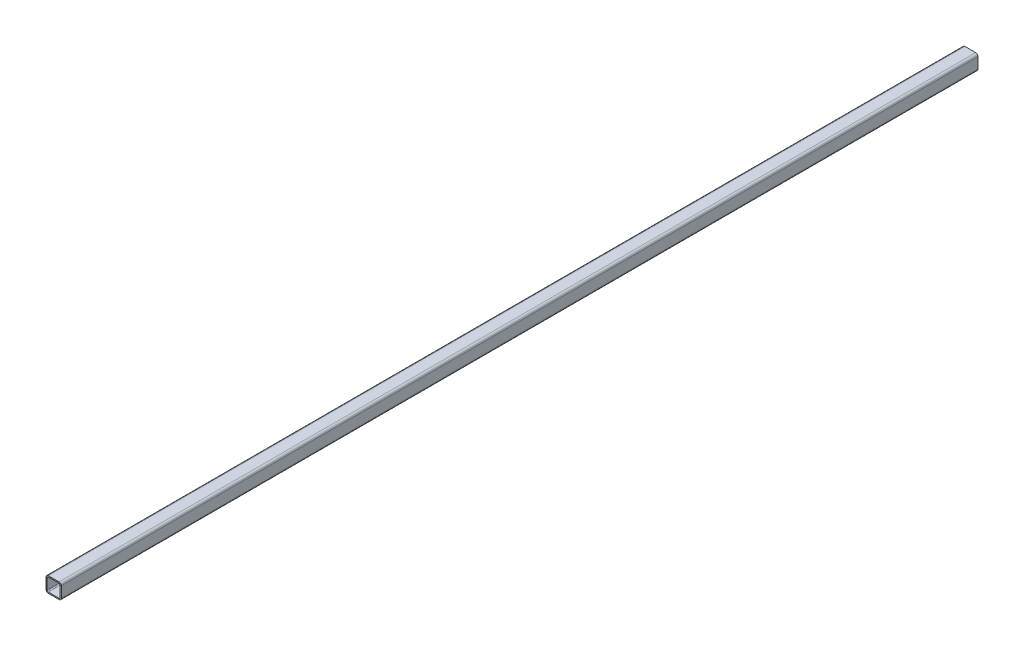
ISO-10303-21;
HEADER;
FILE_DESCRIPTION(('STEP AP214'),'2;1');
FILE_NAME('part.step','',(''),(''),'','','');
FILE_SCHEMA(('AUTOMOTIVE_DESIGN { 1 0 10303 214 1 1 1 1 }'));
ENDSEC;
DATA;
#1=APPLICATION_CONTEXT('core data for automotive mechanical design processes');
#2=APPLICATION_PROTOCOL_DEFINITION('international standard','automotive_design',2000,#1);
#3=PRODUCT_CONTEXT('',#1,'mechanical');
#4=PRODUCT('Part','Part','',(#3));
#5=PRODUCT_RELATED_PRODUCT_CATEGORY('part','',(#4));
#6=PRODUCT_DEFINITION_FORMATION('','',#4);
#7=PRODUCT_DEFINITION_CONTEXT('part definition',#1,'design');
#8=PRODUCT_DEFINITION('design','',#6,#7);
#9=PRODUCT_DEFINITION_SHAPE('','',#8);
#10=(LENGTH_UNIT() NAMED_UNIT(*) SI_UNIT(.MILLI.,.METRE.));
#11=(NAMED_UNIT(*) PLANE_ANGLE_UNIT() SI_UNIT($,.RADIAN.));
#12=(NAMED_UNIT(*) SI_UNIT($,.STERADIAN.) SOLID_ANGLE_UNIT());
#13=UNCERTAINTY_MEASURE_WITH_UNIT(LENGTH_MEASURE(1.E-05),#10,'distance_accuracy_value','');
#14=(GEOMETRIC_REPRESENTATION_CONTEXT(3) GLOBAL_UNCERTAINTY_ASSIGNED_CONTEXT((#13)) GLOBAL_UNIT_ASSIGNED_CONTEXT((#10,
#11,#12)) REPRESENTATION_CONTEXT('',''));
#15=CARTESIAN_POINT('',(0.,0.,0.));
#16=DIRECTION('',(0.,0.,1.));
#17=DIRECTION('',(1.,0.,0.));
#18=AXIS2_PLACEMENT_3D('',#15,#16,#17);
#19=CARTESIAN_POINT('',(14.,14.,1196.5));
#20=DIRECTION('',(0.,0.,-1.));
#21=DIRECTION('',(-1.,0.,0.));
#22=AXIS2_PLACEMENT_3D('',#19,#20,#21);
#23=PLANE('',#22);
#24=CARTESIAN_POINT('',(14.,14.,1196.5));
#25=DIRECTION('',(0.,0.,1.));
#26=DIRECTION('',(-1.,0.,0.));
#27=AXIS2_PLACEMENT_3D('',#24,#25,#26);
#28=CIRCLE('',#27,6.);
#29=CARTESIAN_POINT('',(20.,14.,1196.5));
#30=VERTEX_POINT('',#29);
#31=CARTESIAN_POINT('',(14.,20.,1196.5));
#32=VERTEX_POINT('',#31);
#33=EDGE_CURVE('E247',#30,#32,#28,.T.);
#34=ORIENTED_EDGE('',*,*,#33,.T.);
#35=DIRECTION('',(-1.,0.,0.));
#36=VECTOR('',#35,1.);
#37=CARTESIAN_POINT('',(-14.,20.,1196.5));
#38=LINE('',#37,#36);
#39=CARTESIAN_POINT('',(-14.,20.,1196.5));
#40=VERTEX_POINT('',#39);
#41=EDGE_CURVE('E251',#32,#40,#38,.T.);
#42=ORIENTED_EDGE('',*,*,#41,.T.);
#43=CARTESIAN_POINT('',(-14.,14.,1196.5));
#44=DIRECTION('',(0.,0.,1.));
#45=DIRECTION('',(1.,0.,0.));
#46=AXIS2_PLACEMENT_3D('',#43,#44,#45);
#47=CIRCLE('',#46,6.);
#48=CARTESIAN_POINT('',(-20.,14.,1196.5));
#49=VERTEX_POINT('',#48);
#50=EDGE_CURVE('E255',#40,#49,#47,.T.);
#51=ORIENTED_EDGE('',*,*,#50,.T.);
#52=DIRECTION('',(0.,-1.,0.));
#53=VECTOR('',#52,1.);
#54=CARTESIAN_POINT('',(-20.,14.,1196.5));
#55=LINE('',#54,#53);
#56=CARTESIAN_POINT('',(-20.,-14.,1196.5));
#57=VERTEX_POINT('',#56);
#58=EDGE_CURVE('E258',#49,#57,#55,.T.);
#59=ORIENTED_EDGE('',*,*,#58,.T.);
#60=CARTESIAN_POINT('',(-14.,-14.,1196.5));
#61=DIRECTION('',(0.,0.,1.));
#62=DIRECTION('',(1.,0.,0.));
#63=AXIS2_PLACEMENT_3D('',#60,#61,#62);
#64=CIRCLE('',#63,6.);
#65=CARTESIAN_POINT('',(-14.,-20.,1196.5));
#66=VERTEX_POINT('',#65);
#67=EDGE_CURVE('E261',#57,#66,#64,.T.);
#68=ORIENTED_EDGE('',*,*,#67,.T.);
#69=DIRECTION('',(1.,0.,0.));
#70=VECTOR('',#69,1.);
#71=CARTESIAN_POINT('',(-14.,-20.,1196.5));
#72=LINE('',#71,#70);
#73=CARTESIAN_POINT('',(14.,-20.,1196.5));
#74=VERTEX_POINT('',#73);
#75=EDGE_CURVE('E264',#66,#74,#72,.T.);
#76=ORIENTED_EDGE('',*,*,#75,.T.);
#77=CARTESIAN_POINT('',(14.,-14.,1196.5));
#78=DIRECTION('',(0.,0.,1.));
#79=DIRECTION('',(1.,0.,0.));
#80=AXIS2_PLACEMENT_3D('',#77,#78,#79);
#81=CIRCLE('',#80,6.);
#82=CARTESIAN_POINT('',(20.,-14.,1196.5));
#83=VERTEX_POINT('',#82);
#84=EDGE_CURVE('E267',#74,#83,#81,.T.);
#85=ORIENTED_EDGE('',*,*,#84,.T.);
#86=DIRECTION('',(0.,1.,0.));
#87=VECTOR('',#86,1.);
#88=CARTESIAN_POINT('',(20.,14.,1196.5));
#89=LINE('',#88,#87);
#90=EDGE_CURVE('E270',#83,#30,#89,.T.);
#91=ORIENTED_EDGE('',*,*,#90,.T.);
#92=EDGE_LOOP('',(#34,#42,#51,#59,#68,#76,#85,#91));
#93=FACE_BOUND('',#92,.T.);
#94=CARTESIAN_POINT('',(-14.,14.,1196.5));
#95=DIRECTION('',(0.,0.,1.));
#96=DIRECTION('',(1.,0.,0.));
#97=AXIS2_PLACEMENT_3D('',#94,#95,#96);
#98=CIRCLE('',#97,3.);
#99=CARTESIAN_POINT('',(-14.,17.,1196.5));
#100=VERTEX_POINT('',#99);
#101=CARTESIAN_POINT('',(-17.,14.,1196.5));
#102=VERTEX_POINT('',#101);
#103=EDGE_CURVE('E157',#100,#102,#98,.T.);
#104=ORIENTED_EDGE('',*,*,#103,.F.);
#105=DIRECTION('',(-1.,0.,0.));
#106=VECTOR('',#105,1.);
#107=CARTESIAN_POINT('',(-14.,17.,1196.5));
#108=LINE('',#107,#106);
#109=CARTESIAN_POINT('',(14.,17.,1196.5));
#110=VERTEX_POINT('',#109);
#111=EDGE_CURVE('E199',#110,#100,#108,.T.);
#112=ORIENTED_EDGE('',*,*,#111,.F.);
#113=CARTESIAN_POINT('',(14.,14.,1196.5));
#114=DIRECTION('',(0.,0.,1.));
#115=DIRECTION('',(-1.,0.,0.));
#116=AXIS2_PLACEMENT_3D('',#113,#114,#115);
#117=CIRCLE('',#116,3.);
#118=CARTESIAN_POINT('',(17.,14.,1196.5));
#119=VERTEX_POINT('',#118);
#120=EDGE_CURVE('E196',#119,#110,#117,.T.);
#121=ORIENTED_EDGE('',*,*,#120,.F.);
#122=DIRECTION('',(0.,1.,0.));
#123=VECTOR('',#122,1.);
#124=CARTESIAN_POINT('',(17.,14.,1196.5));
#125=LINE('',#124,#123);
#126=CARTESIAN_POINT('',(17.,-14.,1196.5));
#127=VERTEX_POINT('',#126);
#128=EDGE_CURVE('E193',#127,#119,#125,.T.);
#129=ORIENTED_EDGE('',*,*,#128,.F.);
#130=CARTESIAN_POINT('',(14.,-14.,1196.5));
#131=DIRECTION('',(0.,0.,1.));
#132=DIRECTION('',(1.,0.,0.));
#133=AXIS2_PLACEMENT_3D('',#130,#131,#132);
#134=CIRCLE('',#133,3.);
#135=CARTESIAN_POINT('',(14.,-17.,1196.5));
#136=VERTEX_POINT('',#135);
#137=EDGE_CURVE('E190',#136,#127,#134,.T.);
#138=ORIENTED_EDGE('',*,*,#137,.F.);
#139=DIRECTION('',(1.,0.,0.));
#140=VECTOR('',#139,1.);
#141=CARTESIAN_POINT('',(-14.,-17.,1196.5));
#142=LINE('',#141,#140);
#143=CARTESIAN_POINT('',(-14.,-17.,1196.5));
#144=VERTEX_POINT('',#143);
#145=EDGE_CURVE('E185',#144,#136,#142,.T.);
#146=ORIENTED_EDGE('',*,*,#145,.F.);
#147=CARTESIAN_POINT('',(-14.,-14.,1196.5));
#148=DIRECTION('',(0.,0.,1.));
#149=DIRECTION('',(1.,0.,0.));
#150=AXIS2_PLACEMENT_3D('',#147,#148,#149);
#151=CIRCLE('',#150,3.);
#152=CARTESIAN_POINT('',(-17.,-14.,1196.5));
#153=VERTEX_POINT('',#152);
#154=EDGE_CURVE('E180',#153,#144,#151,.T.);
#155=ORIENTED_EDGE('',*,*,#154,.F.);
#156=DIRECTION('',(0.,-1.,0.));
#157=VECTOR('',#156,1.);
#158=CARTESIAN_POINT('',(-17.,14.,1196.5));
#159=LINE('',#158,#157);
#160=EDGE_CURVE('E166',#102,#153,#159,.T.);
#161=ORIENTED_EDGE('',*,*,#160,.F.);
#162=EDGE_LOOP('',(#104,#112,#121,#129,#138,#146,#155,#161));
#163=FACE_BOUND('',#162,.T.);
#164=ADVANCED_FACE('F43',(#93,#163),#23,.F.);
#165=CARTESIAN_POINT('',(14.,14.,-1196.5));
#166=DIRECTION('',(0.,0.,-1.));
#167=DIRECTION('',(-1.,0.,0.));
#168=AXIS2_PLACEMENT_3D('',#165,#166,#167);
#169=PLANE('',#168);
#170=CARTESIAN_POINT('',(14.,14.,-1196.5));
#171=DIRECTION('',(0.,0.,1.));
#172=DIRECTION('',(-1.,0.,0.));
#173=AXIS2_PLACEMENT_3D('',#170,#171,#172);
#174=CIRCLE('',#173,6.);
#175=CARTESIAN_POINT('',(20.,14.,-1196.5));
#176=VERTEX_POINT('',#175);
#177=CARTESIAN_POINT('',(14.,20.,-1196.5));
#178=VERTEX_POINT('',#177);
#179=EDGE_CURVE('E175',#176,#178,#174,.T.);
#180=ORIENTED_EDGE('',*,*,#179,.F.);
#181=DIRECTION('',(0.,1.,0.));
#182=VECTOR('',#181,1.);
#183=CARTESIAN_POINT('',(20.,14.,-1196.5));
#184=LINE('',#183,#182);
#185=CARTESIAN_POINT('',(20.,-14.,-1196.5));
#186=VERTEX_POINT('',#185);
#187=EDGE_CURVE('E252',#186,#176,#184,.T.);
#188=ORIENTED_EDGE('',*,*,#187,.F.);
#189=CARTESIAN_POINT('',(14.,-14.,-1196.5));
#190=DIRECTION('',(0.,0.,1.));
#191=DIRECTION('',(1.,0.,0.));
#192=AXIS2_PLACEMENT_3D('',#189,#190,#191);
#193=CIRCLE('',#192,6.);
#194=CARTESIAN_POINT('',(14.,-20.,-1196.5));
#195=VERTEX_POINT('',#194);
#196=EDGE_CURVE('E292',#195,#186,#193,.T.);
#197=ORIENTED_EDGE('',*,*,#196,.F.);
#198=DIRECTION('',(1.,0.,0.));
#199=VECTOR('',#198,1.);
#200=CARTESIAN_POINT('',(-14.,-20.,-1196.5));
#201=LINE('',#200,#199);
#202=CARTESIAN_POINT('',(-14.,-20.,-1196.5));
#203=VERTEX_POINT('',#202);
#204=EDGE_CURVE('E289',#203,#195,#201,.T.);
#205=ORIENTED_EDGE('',*,*,#204,.F.);
#206=CARTESIAN_POINT('',(-14.,-14.,-1196.5));
#207=DIRECTION('',(0.,0.,1.));
#208=DIRECTION('',(1.,0.,0.));
#209=AXIS2_PLACEMENT_3D('',#206,#207,#208);
#210=CIRCLE('',#209,6.);
#211=CARTESIAN_POINT('',(-20.,-14.,-1196.5));
#212=VERTEX_POINT('',#211);
#213=EDGE_CURVE('E286',#212,#203,#210,.T.);
#214=ORIENTED_EDGE('',*,*,#213,.F.);
#215=DIRECTION('',(0.,-1.,0.));
#216=VECTOR('',#215,1.);
#217=CARTESIAN_POINT('',(-20.,14.,-1196.5));
#218=LINE('',#217,#216);
#219=CARTESIAN_POINT('',(-20.,14.,-1196.5));
#220=VERTEX_POINT('',#219);
#221=EDGE_CURVE('E283',#220,#212,#218,.T.);
#222=ORIENTED_EDGE('',*,*,#221,.F.);
#223=CARTESIAN_POINT('',(-14.,14.,-1196.5));
#224=DIRECTION('',(0.,0.,1.));
#225=DIRECTION('',(1.,0.,0.));
#226=AXIS2_PLACEMENT_3D('',#223,#224,#225);
#227=CIRCLE('',#226,6.);
#228=CARTESIAN_POINT('',(-14.,20.,-1196.5));
#229=VERTEX_POINT('',#228);
#230=EDGE_CURVE('E280',#229,#220,#227,.T.);
#231=ORIENTED_EDGE('',*,*,#230,.F.);
#232=DIRECTION('',(-1.,0.,0.));
#233=VECTOR('',#232,1.);
#234=CARTESIAN_POINT('',(-14.,20.,-1196.5));
#235=LINE('',#234,#233);
#236=EDGE_CURVE('E277',#178,#229,#235,.T.);
#237=ORIENTED_EDGE('',*,*,#236,.F.);
#238=EDGE_LOOP('',(#180,#188,#197,#205,#214,#222,#231,#237));
#239=FACE_BOUND('',#238,.T.);
#240=DIRECTION('',(-1.,0.,0.));
#241=VECTOR('',#240,1.);
#242=CARTESIAN_POINT('',(-14.,17.,-1196.5));
#243=LINE('',#242,#241);
#244=CARTESIAN_POINT('',(14.,17.,-1196.5));
#245=VERTEX_POINT('',#244);
#246=CARTESIAN_POINT('',(-14.,17.,-1196.5));
#247=VERTEX_POINT('',#246);
#248=EDGE_CURVE('E167',#245,#247,#243,.T.);
#249=ORIENTED_EDGE('',*,*,#248,.T.);
#250=CARTESIAN_POINT('',(-14.,14.,-1196.5));
#251=DIRECTION('',(0.,0.,1.));
#252=DIRECTION('',(1.,0.,0.));
#253=AXIS2_PLACEMENT_3D('',#250,#251,#252);
#254=CIRCLE('',#253,3.);
#255=CARTESIAN_POINT('',(-17.,14.,-1196.5));
#256=VERTEX_POINT('',#255);
#257=EDGE_CURVE('E67',#247,#256,#254,.T.);
#258=ORIENTED_EDGE('',*,*,#257,.T.);
#259=DIRECTION('',(0.,-1.,0.));
#260=VECTOR('',#259,1.);
#261=CARTESIAN_POINT('',(-17.,14.,-1196.5));
#262=LINE('',#261,#260);
#263=CARTESIAN_POINT('',(-17.,-14.,-1196.5));
#264=VERTEX_POINT('',#263);
#265=EDGE_CURVE('E173',#256,#264,#262,.T.);
#266=ORIENTED_EDGE('',*,*,#265,.T.);
#267=CARTESIAN_POINT('',(-14.,-14.,-1196.5));
#268=DIRECTION('',(0.,0.,1.));
#269=DIRECTION('',(1.,0.,0.));
#270=AXIS2_PLACEMENT_3D('',#267,#268,#269);
#271=CIRCLE('',#270,3.);
#272=CARTESIAN_POINT('',(-14.,-17.,-1196.5));
#273=VERTEX_POINT('',#272);
#274=EDGE_CURVE('E206',#264,#273,#271,.T.);
#275=ORIENTED_EDGE('',*,*,#274,.T.);
#276=DIRECTION('',(1.,0.,0.));
#277=VECTOR('',#276,1.);
#278=CARTESIAN_POINT('',(-14.,-17.,-1196.5));
#279=LINE('',#278,#277);
#280=CARTESIAN_POINT('',(14.,-17.,-1196.5));
#281=VERTEX_POINT('',#280);
#282=EDGE_CURVE('E210',#273,#281,#279,.T.);
#283=ORIENTED_EDGE('',*,*,#282,.T.);
#284=CARTESIAN_POINT('',(14.,-14.,-1196.5));
#285=DIRECTION('',(0.,0.,1.));
#286=DIRECTION('',(1.,0.,0.));
#287=AXIS2_PLACEMENT_3D('',#284,#285,#286);
#288=CIRCLE('',#287,3.);
#289=CARTESIAN_POINT('',(17.,-14.,-1196.5));
#290=VERTEX_POINT('',#289);
#291=EDGE_CURVE('E214',#281,#290,#288,.T.);
#292=ORIENTED_EDGE('',*,*,#291,.T.);
#293=DIRECTION('',(0.,1.,0.));
#294=VECTOR('',#293,1.);
#295=CARTESIAN_POINT('',(17.,14.,-1196.5));
#296=LINE('',#295,#294);
#297=CARTESIAN_POINT('',(17.,14.,-1196.5));
#298=VERTEX_POINT('',#297);
#299=EDGE_CURVE('E218',#290,#298,#296,.T.);
#300=ORIENTED_EDGE('',*,*,#299,.T.);
#301=CARTESIAN_POINT('',(14.,14.,-1196.5));
#302=DIRECTION('',(0.,0.,1.));
#303=DIRECTION('',(-1.,0.,0.));
#304=AXIS2_PLACEMENT_3D('',#301,#302,#303);
#305=CIRCLE('',#304,3.);
#306=EDGE_CURVE('E222',#298,#245,#305,.T.);
#307=ORIENTED_EDGE('',*,*,#306,.T.);
#308=EDGE_LOOP('',(#249,#258,#266,#275,#283,#292,#300,#307));
#309=FACE_BOUND('',#308,.T.);
#310=ADVANCED_FACE('F332',(#239,#309),#169,.T.);
#311=CARTESIAN_POINT('',(14.,14.,1196.5));
#312=DIRECTION('',(0.,0.,-1.));
#313=DIRECTION('',(-1.,0.,0.));
#314=AXIS2_PLACEMENT_3D('',#311,#312,#313);
#315=CYLINDRICAL_SURFACE('',#314,6.);
#316=ORIENTED_EDGE('',*,*,#179,.T.);
#317=DIRECTION('',(0.,0.,-1.));
#318=VECTOR('',#317,1.);
#319=CARTESIAN_POINT('',(14.,20.,1196.5));
#320=LINE('',#319,#318);
#321=EDGE_CURVE('E11',#32,#178,#320,.T.);
#322=ORIENTED_EDGE('',*,*,#321,.F.);
#323=ORIENTED_EDGE('',*,*,#33,.F.);
#324=DIRECTION('',(0.,0.,-1.));
#325=VECTOR('',#324,1.);
#326=CARTESIAN_POINT('',(20.,14.,1196.5));
#327=LINE('',#326,#325);
#328=EDGE_CURVE('E273',#30,#176,#327,.T.);
#329=ORIENTED_EDGE('',*,*,#328,.T.);
#330=EDGE_LOOP('',(#316,#322,#323,#329));
#331=FACE_BOUND('',#330,.T.);
#332=ADVANCED_FACE('F45',(#331),#315,.T.);
#333=CARTESIAN_POINT('',(-14.,20.,1196.5));
#334=DIRECTION('',(0.,-1.,0.));
#335=DIRECTION('',(0.,0.,-1.));
#336=AXIS2_PLACEMENT_3D('',#333,#334,#335);
#337=PLANE('',#336);
#338=ORIENTED_EDGE('',*,*,#236,.T.);
#339=DIRECTION('',(0.,0.,-1.));
#340=VECTOR('',#339,1.);
#341=CARTESIAN_POINT('',(-14.,20.,1196.5));
#342=LINE('',#341,#340);
#343=EDGE_CURVE('E52',#40,#229,#342,.T.);
#344=ORIENTED_EDGE('',*,*,#343,.F.);
#345=ORIENTED_EDGE('',*,*,#41,.F.);
#346=ORIENTED_EDGE('',*,*,#321,.T.);
#347=EDGE_LOOP('',(#338,#344,#345,#346));
#348=FACE_BOUND('',#347,.T.);
#349=ADVANCED_FACE('F349',(#348),#337,.F.);
#350=CARTESIAN_POINT('',(-14.,14.,1196.5));
#351=DIRECTION('',(0.,0.,-1.));
#352=DIRECTION('',(-1.,0.,0.));
#353=AXIS2_PLACEMENT_3D('',#350,#351,#352);
#354=CYLINDRICAL_SURFACE('',#353,6.);
#355=ORIENTED_EDGE('',*,*,#230,.T.);
#356=DIRECTION('',(0.,0.,-1.));
#357=VECTOR('',#356,1.);
#358=CARTESIAN_POINT('',(-20.,14.,1196.5));
#359=LINE('',#358,#357);
#360=EDGE_CURVE('E316',#49,#220,#359,.T.);
#361=ORIENTED_EDGE('',*,*,#360,.F.);
#362=ORIENTED_EDGE('',*,*,#50,.F.);
#363=ORIENTED_EDGE('',*,*,#343,.T.);
#364=EDGE_LOOP('',(#355,#361,#362,#363));
#365=FACE_BOUND('',#364,.T.);
#366=ADVANCED_FACE('F326',(#365),#354,.T.);
#367=CARTESIAN_POINT('',(-20.,14.,1196.5));
#368=DIRECTION('',(1.,0.,0.));
#369=DIRECTION('',(0.,1.,0.));
#370=AXIS2_PLACEMENT_3D('',#367,#368,#369);
#371=PLANE('',#370);
#372=ORIENTED_EDGE('',*,*,#221,.T.);
#373=DIRECTION('',(0.,0.,-1.));
#374=VECTOR('',#373,1.);
#375=CARTESIAN_POINT('',(-20.,-14.,1196.5));
#376=LINE('',#375,#374);
#377=EDGE_CURVE('E312',#57,#212,#376,.T.);
#378=ORIENTED_EDGE('',*,*,#377,.F.);
#379=ORIENTED_EDGE('',*,*,#58,.F.);
#380=ORIENTED_EDGE('',*,*,#360,.T.);
#381=EDGE_LOOP('',(#372,#378,#379,#380));
#382=FACE_BOUND('',#381,.T.);
#383=ADVANCED_FACE('F338',(#382),#371,.F.);
#384=CARTESIAN_POINT('',(-14.,-14.,1196.5));
#385=DIRECTION('',(0.,0.,-1.));
#386=DIRECTION('',(-1.,0.,0.));
#387=AXIS2_PLACEMENT_3D('',#384,#385,#386);
#388=CYLINDRICAL_SURFACE('',#387,6.);
#389=ORIENTED_EDGE('',*,*,#213,.T.);
#390=DIRECTION('',(0.,0.,-1.));
#391=VECTOR('',#390,1.);
#392=CARTESIAN_POINT('',(-14.,-20.,1196.5));
#393=LINE('',#392,#391);
#394=EDGE_CURVE('E308',#66,#203,#393,.T.);
#395=ORIENTED_EDGE('',*,*,#394,.F.);
#396=ORIENTED_EDGE('',*,*,#67,.F.);
#397=ORIENTED_EDGE('',*,*,#377,.T.);
#398=EDGE_LOOP('',(#389,#395,#396,#397));
#399=FACE_BOUND('',#398,.T.);
#400=ADVANCED_FACE('F342',(#399),#388,.T.);
#401=CARTESIAN_POINT('',(-14.,-20.,1196.5));
#402=DIRECTION('',(0.,1.,0.));
#403=DIRECTION('',(0.,0.,1.));
#404=AXIS2_PLACEMENT_3D('',#401,#402,#403);
#405=PLANE('',#404);
#406=ORIENTED_EDGE('',*,*,#204,.T.);
#407=DIRECTION('',(0.,0.,-1.));
#408=VECTOR('',#407,1.);
#409=CARTESIAN_POINT('',(14.,-20.,1196.5));
#410=LINE('',#409,#408);
#411=EDGE_CURVE('E304',#74,#195,#410,.T.);
#412=ORIENTED_EDGE('',*,*,#411,.F.);
#413=ORIENTED_EDGE('',*,*,#75,.F.);
#414=ORIENTED_EDGE('',*,*,#394,.T.);
#415=EDGE_LOOP('',(#406,#412,#413,#414));
#416=FACE_BOUND('',#415,.T.);
#417=ADVANCED_FACE('F362',(#416),#405,.F.);
#418=CARTESIAN_POINT('',(14.,-14.,1196.5));
#419=DIRECTION('',(0.,0.,-1.));
#420=DIRECTION('',(-1.,0.,0.));
#421=AXIS2_PLACEMENT_3D('',#418,#419,#420);
#422=CYLINDRICAL_SURFACE('',#421,6.);
#423=ORIENTED_EDGE('',*,*,#196,.T.);
#424=DIRECTION('',(0.,0.,-1.));
#425=VECTOR('',#424,1.);
#426=CARTESIAN_POINT('',(20.,-14.,1196.5));
#427=LINE('',#426,#425);
#428=EDGE_CURVE('E300',#83,#186,#427,.T.);
#429=ORIENTED_EDGE('',*,*,#428,.F.);
#430=ORIENTED_EDGE('',*,*,#84,.F.);
#431=ORIENTED_EDGE('',*,*,#411,.T.);
#432=EDGE_LOOP('',(#423,#429,#430,#431));
#433=FACE_BOUND('',#432,.T.);
#434=ADVANCED_FACE('F360',(#433),#422,.T.);
#435=CARTESIAN_POINT('',(20.,14.,1196.5));
#436=DIRECTION('',(-1.,0.,0.));
#437=DIRECTION('',(0.,-1.,0.));
#438=AXIS2_PLACEMENT_3D('',#435,#436,#437);
#439=PLANE('',#438);
#440=ORIENTED_EDGE('',*,*,#187,.T.);
#441=ORIENTED_EDGE('',*,*,#328,.F.);
#442=ORIENTED_EDGE('',*,*,#90,.F.);
#443=ORIENTED_EDGE('',*,*,#428,.T.);
#444=EDGE_LOOP('',(#440,#441,#442,#443));
#445=FACE_BOUND('',#444,.T.);
#446=ADVANCED_FACE('F355',(#445),#439,.F.);
#447=CARTESIAN_POINT('',(-14.,14.,1196.5));
#448=DIRECTION('',(0.,0.,-1.));
#449=DIRECTION('',(-1.,0.,0.));
#450=AXIS2_PLACEMENT_3D('',#447,#448,#449);
#451=CYLINDRICAL_SURFACE('',#450,3.);
#452=ORIENTED_EDGE('',*,*,#257,.F.);
#453=DIRECTION('',(0.,0.,-1.));
#454=VECTOR('',#453,1.);
#455=CARTESIAN_POINT('',(-14.,17.,1196.5));
#456=LINE('',#455,#454);
#457=EDGE_CURVE('E161',#100,#247,#456,.T.);
#458=ORIENTED_EDGE('',*,*,#457,.F.);
#459=ORIENTED_EDGE('',*,*,#103,.T.);
#460=DIRECTION('',(0.,0.,-1.));
#461=VECTOR('',#460,1.);
#462=CARTESIAN_POINT('',(-17.,14.,1196.5));
#463=LINE('',#462,#461);
#464=EDGE_CURVE('E160',#102,#256,#463,.T.);
#465=ORIENTED_EDGE('',*,*,#464,.T.);
#466=EDGE_LOOP('',(#452,#458,#459,#465));
#467=FACE_BOUND('',#466,.T.);
#468=ADVANCED_FACE('F159',(#467),#451,.F.);
#469=CARTESIAN_POINT('',(-17.,14.,1196.5));
#470=DIRECTION('',(1.,0.,0.));
#471=DIRECTION('',(0.,1.,0.));
#472=AXIS2_PLACEMENT_3D('',#469,#470,#471);
#473=PLANE('',#472);
#474=ORIENTED_EDGE('',*,*,#265,.F.);
#475=ORIENTED_EDGE('',*,*,#464,.F.);
#476=ORIENTED_EDGE('',*,*,#160,.T.);
#477=DIRECTION('',(0.,0.,-1.));
#478=VECTOR('',#477,1.);
#479=CARTESIAN_POINT('',(-17.,-14.,1196.5));
#480=LINE('',#479,#478);
#481=EDGE_CURVE('E176',#153,#264,#480,.T.);
#482=ORIENTED_EDGE('',*,*,#481,.T.);
#483=EDGE_LOOP('',(#474,#475,#476,#482));
#484=FACE_BOUND('',#483,.T.);
#485=ADVANCED_FACE('F170',(#484),#473,.T.);
#486=CARTESIAN_POINT('',(-14.,-14.,1196.5));
#487=DIRECTION('',(0.,0.,-1.));
#488=DIRECTION('',(-1.,0.,0.));
#489=AXIS2_PLACEMENT_3D('',#486,#487,#488);
#490=CYLINDRICAL_SURFACE('',#489,3.);
#491=ORIENTED_EDGE('',*,*,#274,.F.);
#492=ORIENTED_EDGE('',*,*,#481,.F.);
#493=ORIENTED_EDGE('',*,*,#154,.T.);
#494=DIRECTION('',(0.,0.,-1.));
#495=VECTOR('',#494,1.);
#496=CARTESIAN_POINT('',(-14.,-17.,1196.5));
#497=LINE('',#496,#495);
#498=EDGE_CURVE('E242',#144,#273,#497,.T.);
#499=ORIENTED_EDGE('',*,*,#498,.T.);
#500=EDGE_LOOP('',(#491,#492,#493,#499));
#501=FACE_BOUND('',#500,.T.);
#502=ADVANCED_FACE('F387',(#501),#490,.F.);
#503=CARTESIAN_POINT('',(-14.,-17.,1196.5));
#504=DIRECTION('',(0.,1.,0.));
#505=DIRECTION('',(-1.,0.,0.));
#506=AXIS2_PLACEMENT_3D('',#503,#504,#505);
#507=PLANE('',#506);
#508=ORIENTED_EDGE('',*,*,#282,.F.);
#509=ORIENTED_EDGE('',*,*,#498,.F.);
#510=ORIENTED_EDGE('',*,*,#145,.T.);
#511=DIRECTION('',(0.,0.,-1.));
#512=VECTOR('',#511,1.);
#513=CARTESIAN_POINT('',(14.,-17.,1196.5));
#514=LINE('',#513,#512);
#515=EDGE_CURVE('E239',#136,#281,#514,.T.);
#516=ORIENTED_EDGE('',*,*,#515,.T.);
#517=EDGE_LOOP('',(#508,#509,#510,#516));
#518=FACE_BOUND('',#517,.T.);
#519=ADVANCED_FACE('F391',(#518),#507,.T.);
#520=CARTESIAN_POINT('',(14.,-14.,1196.5));
#521=DIRECTION('',(0.,0.,-1.));
#522=DIRECTION('',(-1.,0.,0.));
#523=AXIS2_PLACEMENT_3D('',#520,#521,#522);
#524=CYLINDRICAL_SURFACE('',#523,3.);
#525=ORIENTED_EDGE('',*,*,#291,.F.);
#526=ORIENTED_EDGE('',*,*,#515,.F.);
#527=ORIENTED_EDGE('',*,*,#137,.T.);
#528=DIRECTION('',(0.,0.,-1.));
#529=VECTOR('',#528,1.);
#530=CARTESIAN_POINT('',(17.,-14.,1196.5));
#531=LINE('',#530,#529);
#532=EDGE_CURVE('E236',#127,#290,#531,.T.);
#533=ORIENTED_EDGE('',*,*,#532,.T.);
#534=EDGE_LOOP('',(#525,#526,#527,#533));
#535=FACE_BOUND('',#534,.T.);
#536=ADVANCED_FACE('F397',(#535),#524,.F.);
#537=CARTESIAN_POINT('',(17.,14.,1196.5));
#538=DIRECTION('',(-1.,0.,0.));
#539=DIRECTION('',(0.,-1.,0.));
#540=AXIS2_PLACEMENT_3D('',#537,#538,#539);
#541=PLANE('',#540);
#542=ORIENTED_EDGE('',*,*,#299,.F.);
#543=ORIENTED_EDGE('',*,*,#532,.F.);
#544=ORIENTED_EDGE('',*,*,#128,.T.);
#545=DIRECTION('',(0.,0.,-1.));
#546=VECTOR('',#545,1.);
#547=CARTESIAN_POINT('',(17.,14.,1196.5));
#548=LINE('',#547,#546);
#549=EDGE_CURVE('E233',#119,#298,#548,.T.);
#550=ORIENTED_EDGE('',*,*,#549,.T.);
#551=EDGE_LOOP('',(#542,#543,#544,#550));
#552=FACE_BOUND('',#551,.T.);
#553=ADVANCED_FACE('F401',(#552),#541,.T.);
#554=CARTESIAN_POINT('',(14.,14.,1196.5));
#555=DIRECTION('',(0.,0.,-1.));
#556=DIRECTION('',(-1.,0.,0.));
#557=AXIS2_PLACEMENT_3D('',#554,#555,#556);
#558=CYLINDRICAL_SURFACE('',#557,3.);
#559=ORIENTED_EDGE('',*,*,#306,.F.);
#560=ORIENTED_EDGE('',*,*,#549,.F.);
#561=ORIENTED_EDGE('',*,*,#120,.T.);
#562=DIRECTION('',(0.,0.,-1.));
#563=VECTOR('',#562,1.);
#564=CARTESIAN_POINT('',(14.,17.,1196.5));
#565=LINE('',#564,#563);
#566=EDGE_CURVE('E59',#110,#245,#565,.T.);
#567=ORIENTED_EDGE('',*,*,#566,.T.);
#568=EDGE_LOOP('',(#559,#560,#561,#567));
#569=FACE_BOUND('',#568,.T.);
#570=ADVANCED_FACE('F405',(#569),#558,.F.);
#571=CARTESIAN_POINT('',(-14.,17.,1196.5));
#572=DIRECTION('',(0.,-1.,0.));
#573=DIRECTION('',(0.,0.,-1.));
#574=AXIS2_PLACEMENT_3D('',#571,#572,#573);
#575=PLANE('',#574);
#576=ORIENTED_EDGE('',*,*,#248,.F.);
#577=ORIENTED_EDGE('',*,*,#566,.F.);
#578=ORIENTED_EDGE('',*,*,#111,.T.);
#579=ORIENTED_EDGE('',*,*,#457,.T.);
#580=EDGE_LOOP('',(#576,#577,#578,#579));
#581=FACE_BOUND('',#580,.T.);
#582=ADVANCED_FACE('F409',(#581),#575,.T.);
#583=CLOSED_SHELL('',(#164,#310,#332,#349,#366,#383,#400,#417,#434,#446,#468,#485,#502,#519,
#536,#553,#570,#582));
#584=MANIFOLD_SOLID_BREP('B2',#583);
#585=ADVANCED_BREP_SHAPE_REPRESENTATION('',(#18,#584),#14);
#586=SHAPE_DEFINITION_REPRESENTATION(#9,#585);
ENDSEC;
END-ISO-10303-21;
